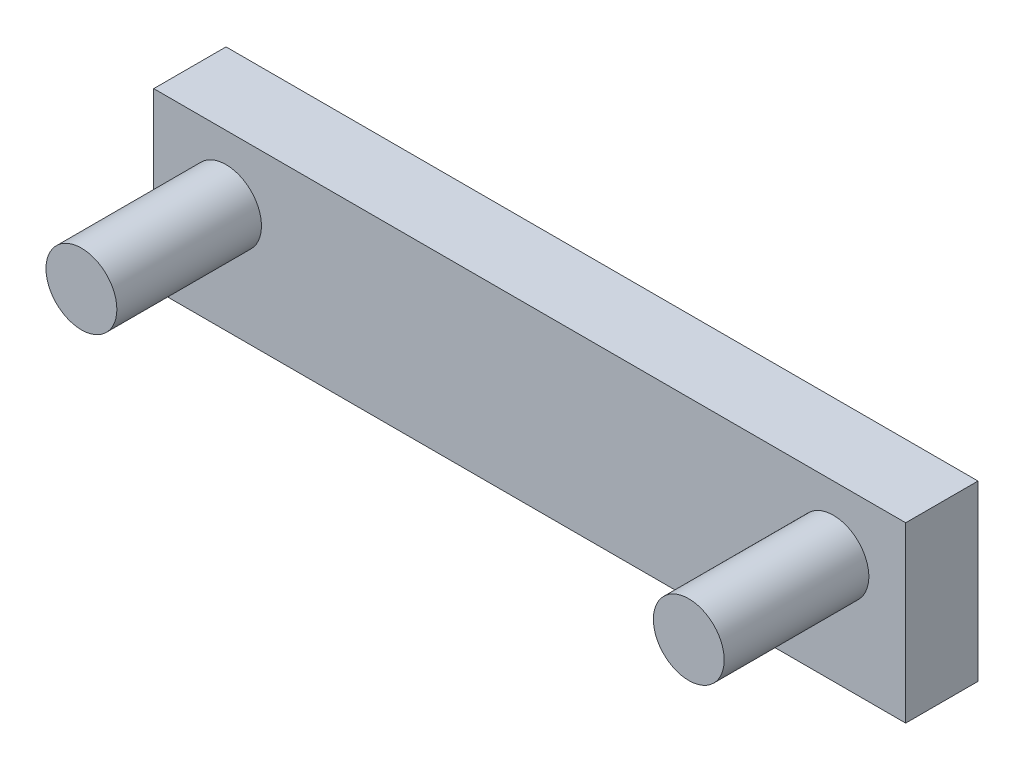
ISO-10303-21;
HEADER;
FILE_DESCRIPTION(('STEP AP214'),'2;1');
FILE_NAME('part.step','',(''),(''),'','','');
FILE_SCHEMA(('AUTOMOTIVE_DESIGN { 1 0 10303 214 1 1 1 1 }'));
ENDSEC;
DATA;
#1=APPLICATION_CONTEXT('core data for automotive mechanical design processes');
#2=APPLICATION_PROTOCOL_DEFINITION('international standard','automotive_design',2000,#1);
#3=PRODUCT_CONTEXT('',#1,'mechanical');
#4=PRODUCT('Part','Part','',(#3));
#5=PRODUCT_RELATED_PRODUCT_CATEGORY('part','',(#4));
#6=PRODUCT_DEFINITION_FORMATION('','',#4);
#7=PRODUCT_DEFINITION_CONTEXT('part definition',#1,'design');
#8=PRODUCT_DEFINITION('design','',#6,#7);
#9=PRODUCT_DEFINITION_SHAPE('','',#8);
#10=(LENGTH_UNIT() NAMED_UNIT(*) SI_UNIT(.MILLI.,.METRE.));
#11=(NAMED_UNIT(*) PLANE_ANGLE_UNIT() SI_UNIT($,.RADIAN.));
#12=(NAMED_UNIT(*) SI_UNIT($,.STERADIAN.) SOLID_ANGLE_UNIT());
#13=UNCERTAINTY_MEASURE_WITH_UNIT(LENGTH_MEASURE(1.E-05),#10,'distance_accuracy_value','');
#14=(GEOMETRIC_REPRESENTATION_CONTEXT(3) GLOBAL_UNCERTAINTY_ASSIGNED_CONTEXT((#13)) GLOBAL_UNIT_ASSIGNED_CONTEXT((#10,
#11,#12)) REPRESENTATION_CONTEXT('',''));
#15=CARTESIAN_POINT('',(0.,0.,0.));
#16=DIRECTION('',(0.,0.,1.));
#17=DIRECTION('',(1.,0.,0.));
#18=AXIS2_PLACEMENT_3D('',#15,#16,#17);
#19=CARTESIAN_POINT('',(21.,0.,10.));
#20=DIRECTION('',(0.,0.,-1.));
#21=DIRECTION('',(-1.,0.,0.));
#22=AXIS2_PLACEMENT_3D('',#19,#20,#21);
#23=CYLINDRICAL_SURFACE('',#22,2.45);
#24=CARTESIAN_POINT('',(21.,0.,10.));
#25=DIRECTION('',(0.,0.,-1.));
#26=DIRECTION('',(-1.,0.,0.));
#27=AXIS2_PLACEMENT_3D('',#24,#25,#26);
#28=CIRCLE('',#27,2.45);
#29=CARTESIAN_POINT('',(18.55,0.,10.));
#30=VERTEX_POINT('',#29);
#31=EDGE_CURVE('E110',#30,#30,#28,.T.);
#32=ORIENTED_EDGE('',*,*,#31,.T.);
#33=EDGE_LOOP('',(#32));
#34=FACE_BOUND('',#33,.T.);
#35=CARTESIAN_POINT('',(21.,0.,0.));
#36=DIRECTION('',(0.,0.,-1.));
#37=DIRECTION('',(-1.,0.,0.));
#38=AXIS2_PLACEMENT_3D('',#35,#36,#37);
#39=CIRCLE('',#38,2.45);
#40=CARTESIAN_POINT('',(18.55,0.,0.));
#41=VERTEX_POINT('',#40);
#42=EDGE_CURVE('E82',#41,#41,#39,.T.);
#43=ORIENTED_EDGE('',*,*,#42,.F.);
#44=EDGE_LOOP('',(#43));
#45=FACE_BOUND('',#44,.T.);
#46=ADVANCED_FACE('F39',(#34,#45),#23,.T.);
#47=CARTESIAN_POINT('',(21.,0.,10.));
#48=DIRECTION('',(0.,0.,-1.));
#49=DIRECTION('',(-1.,0.,0.));
#50=AXIS2_PLACEMENT_3D('',#47,#48,#49);
#51=PLANE('',#50);
#52=ORIENTED_EDGE('',*,*,#31,.F.);
#53=EDGE_LOOP('',(#52));
#54=FACE_BOUND('',#53,.T.);
#55=ADVANCED_FACE('F129',(#54),#51,.F.);
#56=CARTESIAN_POINT('',(26.,-7.5,-5.));
#57=DIRECTION('',(1.,0.,0.));
#58=DIRECTION('',(0.,0.,-1.));
#59=AXIS2_PLACEMENT_3D('',#56,#57,#58);
#60=PLANE('',#59);
#61=DIRECTION('',(0.,0.,-1.));
#62=VECTOR('',#61,1.);
#63=CARTESIAN_POINT('',(26.,4.5,10.));
#64=LINE('',#63,#62);
#65=CARTESIAN_POINT('',(26.,4.5,0.));
#66=VERTEX_POINT('',#65);
#67=CARTESIAN_POINT('',(26.,4.5,-5.));
#68=VERTEX_POINT('',#67);
#69=EDGE_CURVE('E90',#66,#68,#64,.T.);
#70=ORIENTED_EDGE('',*,*,#69,.F.);
#71=DIRECTION('',(0.,1.,0.));
#72=VECTOR('',#71,1.);
#73=CARTESIAN_POINT('',(26.,-7.5,0.));
#74=LINE('',#73,#72);
#75=CARTESIAN_POINT('',(26.,-7.5,0.));
#76=VERTEX_POINT('',#75);
#77=EDGE_CURVE('E87',#76,#66,#74,.T.);
#78=ORIENTED_EDGE('',*,*,#77,.F.);
#79=DIRECTION('',(0.,0.,1.));
#80=VECTOR('',#79,1.);
#81=CARTESIAN_POINT('',(26.,-7.5,-5.));
#82=LINE('',#81,#80);
#83=CARTESIAN_POINT('',(26.,-7.5,-5.));
#84=VERTEX_POINT('',#83);
#85=EDGE_CURVE('E62',#84,#76,#82,.T.);
#86=ORIENTED_EDGE('',*,*,#85,.F.);
#87=DIRECTION('',(0.,1.,0.));
#88=VECTOR('',#87,1.);
#89=CARTESIAN_POINT('',(26.,-7.5,-5.));
#90=LINE('',#89,#88);
#91=EDGE_CURVE('E100',#84,#68,#90,.T.);
#92=ORIENTED_EDGE('',*,*,#91,.T.);
#93=EDGE_LOOP('',(#70,#78,#86,#92));
#94=FACE_BOUND('',#93,.T.);
#95=ADVANCED_FACE('F88',(#94),#60,.T.);
#96=CARTESIAN_POINT('',(-26.,-7.5,-5.));
#97=DIRECTION('',(0.,-1.,0.));
#98=DIRECTION('',(0.,0.,-1.));
#99=AXIS2_PLACEMENT_3D('',#96,#97,#98);
#100=PLANE('',#99);
#101=DIRECTION('',(1.,0.,0.));
#102=VECTOR('',#101,1.);
#103=CARTESIAN_POINT('',(-26.,-7.5,0.));
#104=LINE('',#103,#102);
#105=CARTESIAN_POINT('',(-26.,-7.5,0.));
#106=VERTEX_POINT('',#105);
#107=EDGE_CURVE('E78',#106,#76,#104,.T.);
#108=ORIENTED_EDGE('',*,*,#107,.F.);
#109=DIRECTION('',(0.,0.,1.));
#110=VECTOR('',#109,1.);
#111=CARTESIAN_POINT('',(-26.,-7.5,-5.));
#112=LINE('',#111,#110);
#113=CARTESIAN_POINT('',(-26.,-7.5,-5.));
#114=VERTEX_POINT('',#113);
#115=EDGE_CURVE('E83',#114,#106,#112,.T.);
#116=ORIENTED_EDGE('',*,*,#115,.F.);
#117=DIRECTION('',(1.,0.,0.));
#118=VECTOR('',#117,1.);
#119=CARTESIAN_POINT('',(-26.,-7.5,-5.));
#120=LINE('',#119,#118);
#121=EDGE_CURVE('E80',#114,#84,#120,.T.);
#122=ORIENTED_EDGE('',*,*,#121,.T.);
#123=ORIENTED_EDGE('',*,*,#85,.T.);
#124=EDGE_LOOP('',(#108,#116,#122,#123));
#125=FACE_BOUND('',#124,.T.);
#126=ADVANCED_FACE('F75',(#125),#100,.T.);
#127=CARTESIAN_POINT('',(-26.,-7.5,-5.));
#128=DIRECTION('',(-1.,0.,0.));
#129=DIRECTION('',(0.,0.,1.));
#130=AXIS2_PLACEMENT_3D('',#127,#128,#129);
#131=PLANE('',#130);
#132=DIRECTION('',(0.,0.,-1.));
#133=VECTOR('',#132,1.);
#134=CARTESIAN_POINT('',(-26.,4.5,10.));
#135=LINE('',#134,#133);
#136=CARTESIAN_POINT('',(-26.,4.5,0.));
#137=VERTEX_POINT('',#136);
#138=CARTESIAN_POINT('',(-26.,4.5,-5.));
#139=VERTEX_POINT('',#138);
#140=EDGE_CURVE('E54',#137,#139,#135,.T.);
#141=ORIENTED_EDGE('',*,*,#140,.T.);
#142=DIRECTION('',(0.,-1.,0.));
#143=VECTOR('',#142,1.);
#144=CARTESIAN_POINT('',(-26.,-7.5,-5.));
#145=LINE('',#144,#143);
#146=EDGE_CURVE('E104',#139,#114,#145,.T.);
#147=ORIENTED_EDGE('',*,*,#146,.T.);
#148=ORIENTED_EDGE('',*,*,#115,.T.);
#149=DIRECTION('',(0.,-1.,0.));
#150=VECTOR('',#149,1.);
#151=CARTESIAN_POINT('',(-26.,-7.5,0.));
#152=LINE('',#151,#150);
#153=EDGE_CURVE('E93',#137,#106,#152,.T.);
#154=ORIENTED_EDGE('',*,*,#153,.F.);
#155=EDGE_LOOP('',(#141,#147,#148,#154));
#156=FACE_BOUND('',#155,.T.);
#157=ADVANCED_FACE('F141',(#156),#131,.T.);
#158=CARTESIAN_POINT('',(0.,0.,-5.));
#159=DIRECTION('',(0.,0.,-1.));
#160=DIRECTION('',(-1.,0.,0.));
#161=AXIS2_PLACEMENT_3D('',#158,#159,#160);
#162=PLANE('',#161);
#163=DIRECTION('',(-1.,0.,0.));
#164=VECTOR('',#163,1.);
#165=CARTESIAN_POINT('',(26.,4.5,-5.));
#166=LINE('',#165,#164);
#167=EDGE_CURVE('E164',#68,#139,#166,.T.);
#168=ORIENTED_EDGE('',*,*,#167,.F.);
#169=ORIENTED_EDGE('',*,*,#91,.F.);
#170=ORIENTED_EDGE('',*,*,#121,.F.);
#171=ORIENTED_EDGE('',*,*,#146,.F.);
#172=EDGE_LOOP('',(#168,#169,#170,#171));
#173=FACE_BOUND('',#172,.T.);
#174=ADVANCED_FACE('F124',(#173),#162,.T.);
#175=CARTESIAN_POINT('',(0.,0.,0.));
#176=DIRECTION('',(0.,0.,-1.));
#177=DIRECTION('',(-1.,0.,0.));
#178=AXIS2_PLACEMENT_3D('',#175,#176,#177);
#179=PLANE('',#178);
#180=CARTESIAN_POINT('',(-21.,0.,0.));
#181=DIRECTION('',(0.,0.,-1.));
#182=DIRECTION('',(-1.,0.,0.));
#183=AXIS2_PLACEMENT_3D('',#180,#181,#182);
#184=CIRCLE('',#183,2.45);
#185=CARTESIAN_POINT('',(-23.45,0.,0.));
#186=VERTEX_POINT('',#185);
#187=EDGE_CURVE('E47',#186,#186,#184,.F.);
#188=ORIENTED_EDGE('',*,*,#187,.F.);
#189=EDGE_LOOP('',(#188));
#190=FACE_BOUND('',#189,.T.);
#191=ORIENTED_EDGE('',*,*,#42,.T.);
#192=EDGE_LOOP('',(#191));
#193=FACE_BOUND('',#192,.T.);
#194=ORIENTED_EDGE('',*,*,#77,.T.);
#195=DIRECTION('',(-1.,0.,0.));
#196=VECTOR('',#195,1.);
#197=CARTESIAN_POINT('',(0.,4.5,0.));
#198=LINE('',#197,#196);
#199=EDGE_CURVE('E11',#66,#137,#198,.T.);
#200=ORIENTED_EDGE('',*,*,#199,.T.);
#201=ORIENTED_EDGE('',*,*,#153,.T.);
#202=ORIENTED_EDGE('',*,*,#107,.T.);
#203=EDGE_LOOP('',(#194,#200,#201,#202));
#204=FACE_BOUND('',#203,.T.);
#205=ADVANCED_FACE('F96',(#190,#193,#204),#179,.F.);
#206=CARTESIAN_POINT('',(-21.,0.,10.));
#207=DIRECTION('',(0.,0.,-1.));
#208=DIRECTION('',(-1.,0.,0.));
#209=AXIS2_PLACEMENT_3D('',#206,#207,#208);
#210=CYLINDRICAL_SURFACE('',#209,2.45);
#211=CARTESIAN_POINT('',(-21.,0.,10.));
#212=DIRECTION('',(0.,0.,1.));
#213=DIRECTION('',(1.,0.,0.));
#214=AXIS2_PLACEMENT_3D('',#211,#212,#213);
#215=CIRCLE('',#214,2.45);
#216=CARTESIAN_POINT('',(-18.55,0.,10.));
#217=VERTEX_POINT('',#216);
#218=EDGE_CURVE('E94',#217,#217,#215,.T.);
#219=ORIENTED_EDGE('',*,*,#218,.F.);
#220=EDGE_LOOP('',(#219));
#221=FACE_BOUND('',#220,.T.);
#222=ORIENTED_EDGE('',*,*,#187,.T.);
#223=EDGE_LOOP('',(#222));
#224=FACE_BOUND('',#223,.T.);
#225=ADVANCED_FACE('F120',(#221,#224),#210,.T.);
#226=CARTESIAN_POINT('',(-21.,0.,10.));
#227=DIRECTION('',(0.,0.,1.));
#228=DIRECTION('',(1.,0.,0.));
#229=AXIS2_PLACEMENT_3D('',#226,#227,#228);
#230=PLANE('',#229);
#231=ORIENTED_EDGE('',*,*,#218,.T.);
#232=EDGE_LOOP('',(#231));
#233=FACE_BOUND('',#232,.T.);
#234=ADVANCED_FACE('F150',(#233),#230,.T.);
#235=CARTESIAN_POINT('',(26.,4.5,10.));
#236=DIRECTION('',(0.,-1.,0.));
#237=DIRECTION('',(0.,0.,-1.));
#238=AXIS2_PLACEMENT_3D('',#235,#236,#237);
#239=PLANE('',#238);
#240=ORIENTED_EDGE('',*,*,#69,.T.);
#241=ORIENTED_EDGE('',*,*,#167,.T.);
#242=ORIENTED_EDGE('',*,*,#140,.F.);
#243=ORIENTED_EDGE('',*,*,#199,.F.);
#244=EDGE_LOOP('',(#240,#241,#242,#243));
#245=FACE_BOUND('',#244,.T.);
#246=ADVANCED_FACE('F153',(#245),#239,.F.);
#247=CLOSED_SHELL('',(#46,#55,#95,#126,#157,#174,#205,#225,#234,#246));
#248=MANIFOLD_SOLID_BREP('B2',#247);
#249=ADVANCED_BREP_SHAPE_REPRESENTATION('',(#18,#248),#14);
#250=SHAPE_DEFINITION_REPRESENTATION(#9,#249);
ENDSEC;
END-ISO-10303-21;
